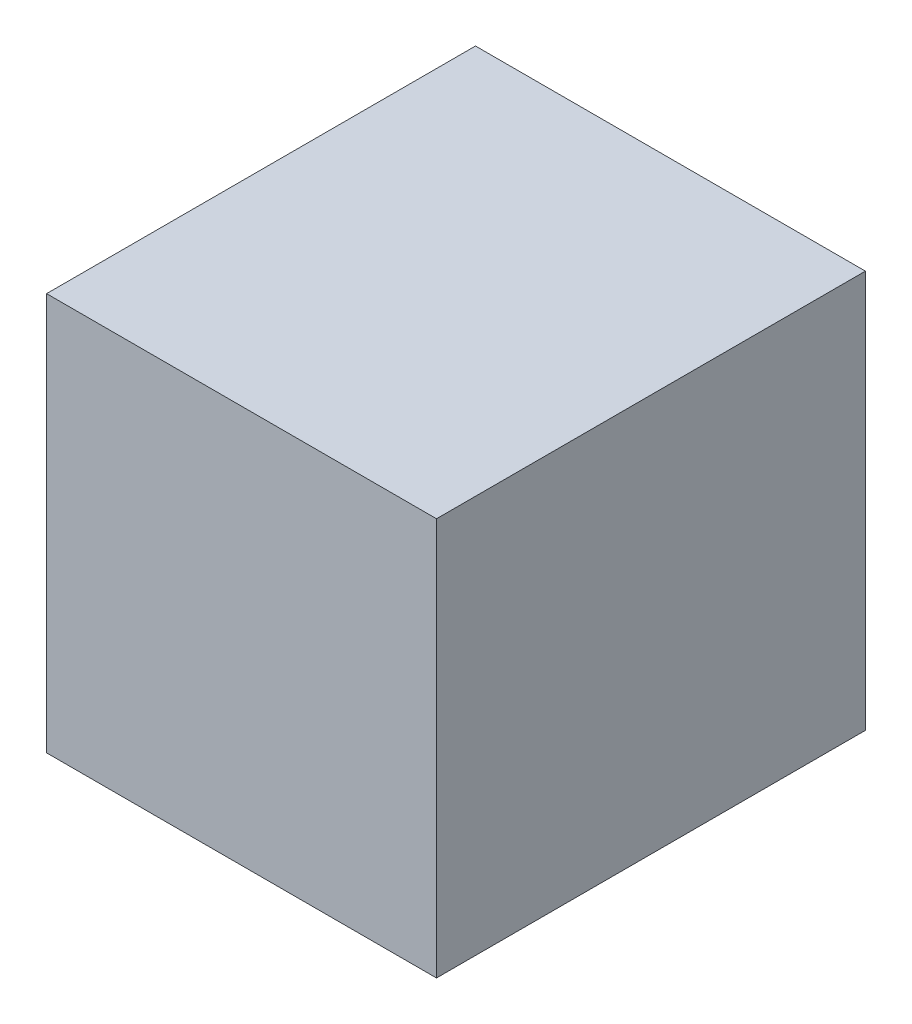
ISO-10303-21;
HEADER;
FILE_DESCRIPTION(('STEP AP214'),'2;1');
FILE_NAME('part.step','',(''),(''),'','','');
FILE_SCHEMA(('AUTOMOTIVE_DESIGN { 1 0 10303 214 1 1 1 1 }'));
ENDSEC;
DATA;
#1=APPLICATION_CONTEXT('core data for automotive mechanical design processes');
#2=APPLICATION_PROTOCOL_DEFINITION('international standard','automotive_design',2000,#1);
#3=PRODUCT_CONTEXT('',#1,'mechanical');
#4=PRODUCT('Part','Part','',(#3));
#5=PRODUCT_RELATED_PRODUCT_CATEGORY('part','',(#4));
#6=PRODUCT_DEFINITION_FORMATION('','',#4);
#7=PRODUCT_DEFINITION_CONTEXT('part definition',#1,'design');
#8=PRODUCT_DEFINITION('design','',#6,#7);
#9=PRODUCT_DEFINITION_SHAPE('','',#8);
#10=(LENGTH_UNIT() NAMED_UNIT(*) SI_UNIT(.MILLI.,.METRE.));
#11=(NAMED_UNIT(*) PLANE_ANGLE_UNIT() SI_UNIT($,.RADIAN.));
#12=(NAMED_UNIT(*) SI_UNIT($,.STERADIAN.) SOLID_ANGLE_UNIT());
#13=UNCERTAINTY_MEASURE_WITH_UNIT(LENGTH_MEASURE(1.E-05),#10,'distance_accuracy_value','');
#14=(GEOMETRIC_REPRESENTATION_CONTEXT(3) GLOBAL_UNCERTAINTY_ASSIGNED_CONTEXT((#13)) GLOBAL_UNIT_ASSIGNED_CONTEXT((#10,
#11,#12)) REPRESENTATION_CONTEXT('',''));
#15=CARTESIAN_POINT('',(0.,0.,0.));
#16=DIRECTION('',(0.,0.,1.));
#17=DIRECTION('',(1.,0.,0.));
#18=AXIS2_PLACEMENT_3D('',#15,#16,#17);
#19=CARTESIAN_POINT('',(0.,0.,0.));
#20=DIRECTION('',(0.,0.,1.));
#21=DIRECTION('',(1.,0.,0.));
#22=AXIS2_PLACEMENT_3D('',#19,#20,#21);
#23=PLANE('',#22);
#24=DIRECTION('',(1.,0.,0.));
#25=VECTOR('',#24,1.);
#26=CARTESIAN_POINT('',(0.,-20.5,0.));
#27=LINE('',#26,#25);
#28=CARTESIAN_POINT('',(-20.,-20.5,0.));
#29=VERTEX_POINT('',#28);
#30=CARTESIAN_POINT('',(20.,-20.5,0.));
#31=VERTEX_POINT('',#30);
#32=EDGE_CURVE('E112',#29,#31,#27,.T.);
#33=ORIENTED_EDGE('',*,*,#32,.F.);
#34=DIRECTION('',(0.,1.,0.));
#35=VECTOR('',#34,1.);
#36=CARTESIAN_POINT('',(-20.,0.,0.));
#37=LINE('',#36,#35);
#38=CARTESIAN_POINT('',(-20.,20.5,0.));
#39=VERTEX_POINT('',#38);
#40=EDGE_CURVE('E120',#29,#39,#37,.T.);
#41=ORIENTED_EDGE('',*,*,#40,.T.);
#42=DIRECTION('',(1.,0.,0.));
#43=VECTOR('',#42,1.);
#44=CARTESIAN_POINT('',(0.,20.5,0.));
#45=LINE('',#44,#43);
#46=CARTESIAN_POINT('',(20.,20.5,0.));
#47=VERTEX_POINT('',#46);
#48=EDGE_CURVE('E137',#39,#47,#45,.T.);
#49=ORIENTED_EDGE('',*,*,#48,.T.);
#50=DIRECTION('',(0.,1.,0.));
#51=VECTOR('',#50,1.);
#52=CARTESIAN_POINT('',(20.,0.,0.));
#53=LINE('',#52,#51);
#54=EDGE_CURVE('E167',#31,#47,#53,.T.);
#55=ORIENTED_EDGE('',*,*,#54,.F.);
#56=EDGE_LOOP('',(#33,#41,#49,#55));
#57=FACE_BOUND('',#56,.T.);
#58=ADVANCED_FACE('F41',(#57),#23,.F.);
#59=CARTESIAN_POINT('',(20.,0.,0.));
#60=DIRECTION('',(1.,0.,0.));
#61=DIRECTION('',(0.,1.,0.));
#62=AXIS2_PLACEMENT_3D('',#59,#60,#61);
#63=PLANE('',#62);
#64=DIRECTION('',(0.,0.,-1.));
#65=VECTOR('',#64,1.);
#66=CARTESIAN_POINT('',(20.,-20.5,0.));
#67=LINE('',#66,#65);
#68=CARTESIAN_POINT('',(20.,-20.5,-50.));
#69=VERTEX_POINT('',#68);
#70=EDGE_CURVE('E108',#31,#69,#67,.T.);
#71=ORIENTED_EDGE('',*,*,#70,.F.);
#72=ORIENTED_EDGE('',*,*,#54,.T.);
#73=DIRECTION('',(0.,0.,-1.));
#74=VECTOR('',#73,1.);
#75=CARTESIAN_POINT('',(20.,20.5,0.));
#76=LINE('',#75,#74);
#77=CARTESIAN_POINT('',(20.,20.5,-50.));
#78=VERTEX_POINT('',#77);
#79=EDGE_CURVE('E134',#47,#78,#76,.T.);
#80=ORIENTED_EDGE('',*,*,#79,.T.);
#81=DIRECTION('',(0.,1.,0.));
#82=VECTOR('',#81,1.);
#83=CARTESIAN_POINT('',(20.,25.5,-50.));
#84=LINE('',#83,#82);
#85=EDGE_CURVE('E141',#69,#78,#84,.T.);
#86=ORIENTED_EDGE('',*,*,#85,.F.);
#87=EDGE_LOOP('',(#71,#72,#80,#86));
#88=FACE_BOUND('',#87,.T.);
#89=ADVANCED_FACE('F175',(#88),#63,.F.);
#90=CARTESIAN_POINT('',(-20.,0.,0.));
#91=DIRECTION('',(1.,0.,0.));
#92=DIRECTION('',(0.,1.,0.));
#93=AXIS2_PLACEMENT_3D('',#90,#91,#92);
#94=PLANE('',#93);
#95=ORIENTED_EDGE('',*,*,#40,.F.);
#96=DIRECTION('',(0.,0.,-1.));
#97=VECTOR('',#96,1.);
#98=CARTESIAN_POINT('',(-20.,-20.5,0.));
#99=LINE('',#98,#97);
#100=CARTESIAN_POINT('',(-20.,-20.5,-50.));
#101=VERTEX_POINT('',#100);
#102=EDGE_CURVE('E11',#29,#101,#99,.T.);
#103=ORIENTED_EDGE('',*,*,#102,.T.);
#104=DIRECTION('',(0.,-1.,0.));
#105=VECTOR('',#104,1.);
#106=CARTESIAN_POINT('',(-20.,-25.5,-50.));
#107=LINE('',#106,#105);
#108=CARTESIAN_POINT('',(-20.,20.5,-50.));
#109=VERTEX_POINT('',#108);
#110=EDGE_CURVE('E118',#109,#101,#107,.T.);
#111=ORIENTED_EDGE('',*,*,#110,.F.);
#112=DIRECTION('',(0.,0.,1.));
#113=VECTOR('',#112,1.);
#114=CARTESIAN_POINT('',(-20.,20.5,0.));
#115=LINE('',#114,#113);
#116=EDGE_CURVE('E49',#109,#39,#115,.T.);
#117=ORIENTED_EDGE('',*,*,#116,.T.);
#118=EDGE_LOOP('',(#95,#103,#111,#117));
#119=FACE_BOUND('',#118,.T.);
#120=ADVANCED_FACE('F116',(#119),#94,.T.);
#121=CARTESIAN_POINT('',(25.,25.5,5.));
#122=DIRECTION('',(-1.,0.,0.));
#123=DIRECTION('',(0.,-1.,0.));
#124=AXIS2_PLACEMENT_3D('',#121,#122,#123);
#125=PLANE('',#124);
#126=DIRECTION('',(0.,1.,0.));
#127=VECTOR('',#126,1.);
#128=CARTESIAN_POINT('',(25.,25.5,-50.));
#129=LINE('',#128,#127);
#130=CARTESIAN_POINT('',(25.,-25.5,-50.));
#131=VERTEX_POINT('',#130);
#132=CARTESIAN_POINT('',(25.,25.5,-50.));
#133=VERTEX_POINT('',#132);
#134=EDGE_CURVE('E140',#131,#133,#129,.T.);
#135=ORIENTED_EDGE('',*,*,#134,.T.);
#136=DIRECTION('',(0.,0.,-1.));
#137=VECTOR('',#136,1.);
#138=CARTESIAN_POINT('',(25.,25.5,5.));
#139=LINE('',#138,#137);
#140=CARTESIAN_POINT('',(25.,25.5,5.));
#141=VERTEX_POINT('',#140);
#142=EDGE_CURVE('E164',#141,#133,#139,.T.);
#143=ORIENTED_EDGE('',*,*,#142,.F.);
#144=DIRECTION('',(0.,1.,0.));
#145=VECTOR('',#144,1.);
#146=CARTESIAN_POINT('',(25.,25.5,5.));
#147=LINE('',#146,#145);
#148=CARTESIAN_POINT('',(25.,-25.5,5.));
#149=VERTEX_POINT('',#148);
#150=EDGE_CURVE('E148',#149,#141,#147,.T.);
#151=ORIENTED_EDGE('',*,*,#150,.F.);
#152=DIRECTION('',(0.,0.,-1.));
#153=VECTOR('',#152,1.);
#154=CARTESIAN_POINT('',(25.,-25.5,5.));
#155=LINE('',#154,#153);
#156=EDGE_CURVE('E156',#149,#131,#155,.T.);
#157=ORIENTED_EDGE('',*,*,#156,.T.);
#158=EDGE_LOOP('',(#135,#143,#151,#157));
#159=FACE_BOUND('',#158,.T.);
#160=ADVANCED_FACE('F43',(#159),#125,.F.);
#161=CARTESIAN_POINT('',(-25.,25.5,5.));
#162=DIRECTION('',(0.,-1.,0.));
#163=DIRECTION('',(0.,0.,-1.));
#164=AXIS2_PLACEMENT_3D('',#161,#162,#163);
#165=PLANE('',#164);
#166=ORIENTED_EDGE('',*,*,#142,.T.);
#167=DIRECTION('',(1.,0.,0.));
#168=VECTOR('',#167,1.);
#169=CARTESIAN_POINT('',(20.,25.5,-50.));
#170=LINE('',#169,#168);
#171=CARTESIAN_POINT('',(-25.,25.5,-50.));
#172=VERTEX_POINT('',#171);
#173=EDGE_CURVE('E145',#172,#133,#170,.T.);
#174=ORIENTED_EDGE('',*,*,#173,.F.);
#175=DIRECTION('',(0.,0.,-1.));
#176=VECTOR('',#175,1.);
#177=CARTESIAN_POINT('',(-25.,25.5,5.));
#178=LINE('',#177,#176);
#179=CARTESIAN_POINT('',(-25.,25.5,5.));
#180=VERTEX_POINT('',#179);
#181=EDGE_CURVE('E161',#180,#172,#178,.T.);
#182=ORIENTED_EDGE('',*,*,#181,.F.);
#183=DIRECTION('',(-1.,0.,0.));
#184=VECTOR('',#183,1.);
#185=CARTESIAN_POINT('',(-25.,25.5,5.));
#186=LINE('',#185,#184);
#187=EDGE_CURVE('E152',#141,#180,#186,.T.);
#188=ORIENTED_EDGE('',*,*,#187,.F.);
#189=EDGE_LOOP('',(#166,#174,#182,#188));
#190=FACE_BOUND('',#189,.T.);
#191=ADVANCED_FACE('F197',(#190),#165,.F.);
#192=CARTESIAN_POINT('',(-25.,25.5,5.));
#193=DIRECTION('',(1.,0.,0.));
#194=DIRECTION('',(0.,1.,0.));
#195=AXIS2_PLACEMENT_3D('',#192,#193,#194);
#196=PLANE('',#195);
#197=DIRECTION('',(0.,0.,-1.));
#198=VECTOR('',#197,1.);
#199=CARTESIAN_POINT('',(-25.,-25.5,5.));
#200=LINE('',#199,#198);
#201=CARTESIAN_POINT('',(-25.,-25.5,5.));
#202=VERTEX_POINT('',#201);
#203=CARTESIAN_POINT('',(-25.,-25.5,-50.));
#204=VERTEX_POINT('',#203);
#205=EDGE_CURVE('E158',#202,#204,#200,.T.);
#206=ORIENTED_EDGE('',*,*,#205,.F.);
#207=DIRECTION('',(0.,-1.,0.));
#208=VECTOR('',#207,1.);
#209=CARTESIAN_POINT('',(-25.,25.5,5.));
#210=LINE('',#209,#208);
#211=EDGE_CURVE('E61',#180,#202,#210,.T.);
#212=ORIENTED_EDGE('',*,*,#211,.F.);
#213=ORIENTED_EDGE('',*,*,#181,.T.);
#214=DIRECTION('',(0.,1.,0.));
#215=VECTOR('',#214,1.);
#216=CARTESIAN_POINT('',(-25.,20.5,-50.));
#217=LINE('',#216,#215);
#218=EDGE_CURVE('E132',#204,#172,#217,.T.);
#219=ORIENTED_EDGE('',*,*,#218,.F.);
#220=EDGE_LOOP('',(#206,#212,#213,#219));
#221=FACE_BOUND('',#220,.T.);
#222=ADVANCED_FACE('F194',(#221),#196,.F.);
#223=CARTESIAN_POINT('',(-25.,-25.5,5.));
#224=DIRECTION('',(0.,1.,0.));
#225=DIRECTION('',(0.,0.,1.));
#226=AXIS2_PLACEMENT_3D('',#223,#224,#225);
#227=PLANE('',#226);
#228=ORIENTED_EDGE('',*,*,#205,.T.);
#229=DIRECTION('',(1.,0.,0.));
#230=VECTOR('',#229,1.);
#231=CARTESIAN_POINT('',(20.,-25.5,-50.));
#232=LINE('',#231,#230);
#233=EDGE_CURVE('E143',#204,#131,#232,.T.);
#234=ORIENTED_EDGE('',*,*,#233,.T.);
#235=ORIENTED_EDGE('',*,*,#156,.F.);
#236=DIRECTION('',(1.,0.,0.));
#237=VECTOR('',#236,1.);
#238=CARTESIAN_POINT('',(-25.,-25.5,5.));
#239=LINE('',#238,#237);
#240=EDGE_CURVE('E56',#202,#149,#239,.T.);
#241=ORIENTED_EDGE('',*,*,#240,.F.);
#242=EDGE_LOOP('',(#228,#234,#235,#241));
#243=FACE_BOUND('',#242,.T.);
#244=ADVANCED_FACE('F190',(#243),#227,.F.);
#245=CARTESIAN_POINT('',(0.,0.,5.));
#246=DIRECTION('',(0.,0.,1.));
#247=DIRECTION('',(1.,0.,0.));
#248=AXIS2_PLACEMENT_3D('',#245,#246,#247);
#249=PLANE('',#248);
#250=ORIENTED_EDGE('',*,*,#150,.T.);
#251=ORIENTED_EDGE('',*,*,#187,.T.);
#252=ORIENTED_EDGE('',*,*,#211,.T.);
#253=ORIENTED_EDGE('',*,*,#240,.T.);
#254=EDGE_LOOP('',(#250,#251,#252,#253));
#255=FACE_BOUND('',#254,.T.);
#256=ADVANCED_FACE('F188',(#255),#249,.T.);
#257=CARTESIAN_POINT('',(20.,25.5,-50.));
#258=DIRECTION('',(0.,0.,-1.));
#259=DIRECTION('',(-1.,0.,0.));
#260=AXIS2_PLACEMENT_3D('',#257,#258,#259);
#261=PLANE('',#260);
#262=DIRECTION('',(1.,0.,0.));
#263=VECTOR('',#262,1.);
#264=CARTESIAN_POINT('',(-25.,-20.5,-50.));
#265=LINE('',#264,#263);
#266=EDGE_CURVE('E104',#101,#69,#265,.T.);
#267=ORIENTED_EDGE('',*,*,#266,.T.);
#268=ORIENTED_EDGE('',*,*,#85,.T.);
#269=DIRECTION('',(-1.,0.,0.));
#270=VECTOR('',#269,1.);
#271=CARTESIAN_POINT('',(-25.,20.5,-50.));
#272=LINE('',#271,#270);
#273=EDGE_CURVE('E125',#78,#109,#272,.T.);
#274=ORIENTED_EDGE('',*,*,#273,.T.);
#275=ORIENTED_EDGE('',*,*,#110,.T.);
#276=EDGE_LOOP('',(#267,#268,#274,#275));
#277=FACE_BOUND('',#276,.T.);
#278=ORIENTED_EDGE('',*,*,#218,.T.);
#279=ORIENTED_EDGE('',*,*,#173,.T.);
#280=ORIENTED_EDGE('',*,*,#134,.F.);
#281=ORIENTED_EDGE('',*,*,#233,.F.);
#282=EDGE_LOOP('',(#278,#279,#280,#281));
#283=FACE_BOUND('',#282,.T.);
#284=ADVANCED_FACE('F122',(#277,#283),#261,.T.);
#285=CARTESIAN_POINT('',(0.,20.5,0.));
#286=DIRECTION('',(0.,-1.,0.));
#287=DIRECTION('',(0.,0.,-1.));
#288=AXIS2_PLACEMENT_3D('',#285,#286,#287);
#289=PLANE('',#288);
#290=ORIENTED_EDGE('',*,*,#116,.F.);
#291=ORIENTED_EDGE('',*,*,#273,.F.);
#292=ORIENTED_EDGE('',*,*,#79,.F.);
#293=ORIENTED_EDGE('',*,*,#48,.F.);
#294=EDGE_LOOP('',(#290,#291,#292,#293));
#295=FACE_BOUND('',#294,.T.);
#296=ADVANCED_FACE('F171',(#295),#289,.T.);
#297=CARTESIAN_POINT('',(0.,-20.5,0.));
#298=DIRECTION('',(0.,-1.,0.));
#299=DIRECTION('',(0.,0.,-1.));
#300=AXIS2_PLACEMENT_3D('',#297,#298,#299);
#301=PLANE('',#300);
#302=ORIENTED_EDGE('',*,*,#32,.T.);
#303=ORIENTED_EDGE('',*,*,#70,.T.);
#304=ORIENTED_EDGE('',*,*,#266,.F.);
#305=ORIENTED_EDGE('',*,*,#102,.F.);
#306=EDGE_LOOP('',(#302,#303,#304,#305));
#307=FACE_BOUND('',#306,.T.);
#308=ADVANCED_FACE('F105',(#307),#301,.F.);
#309=CLOSED_SHELL('',(#58,#89,#120,#160,#191,#222,#244,#256,#284,#296,#308));
#310=MANIFOLD_SOLID_BREP('B2',#309);
#311=ADVANCED_BREP_SHAPE_REPRESENTATION('',(#18,#310),#14);
#312=SHAPE_DEFINITION_REPRESENTATION(#9,#311);
ENDSEC;
END-ISO-10303-21;
